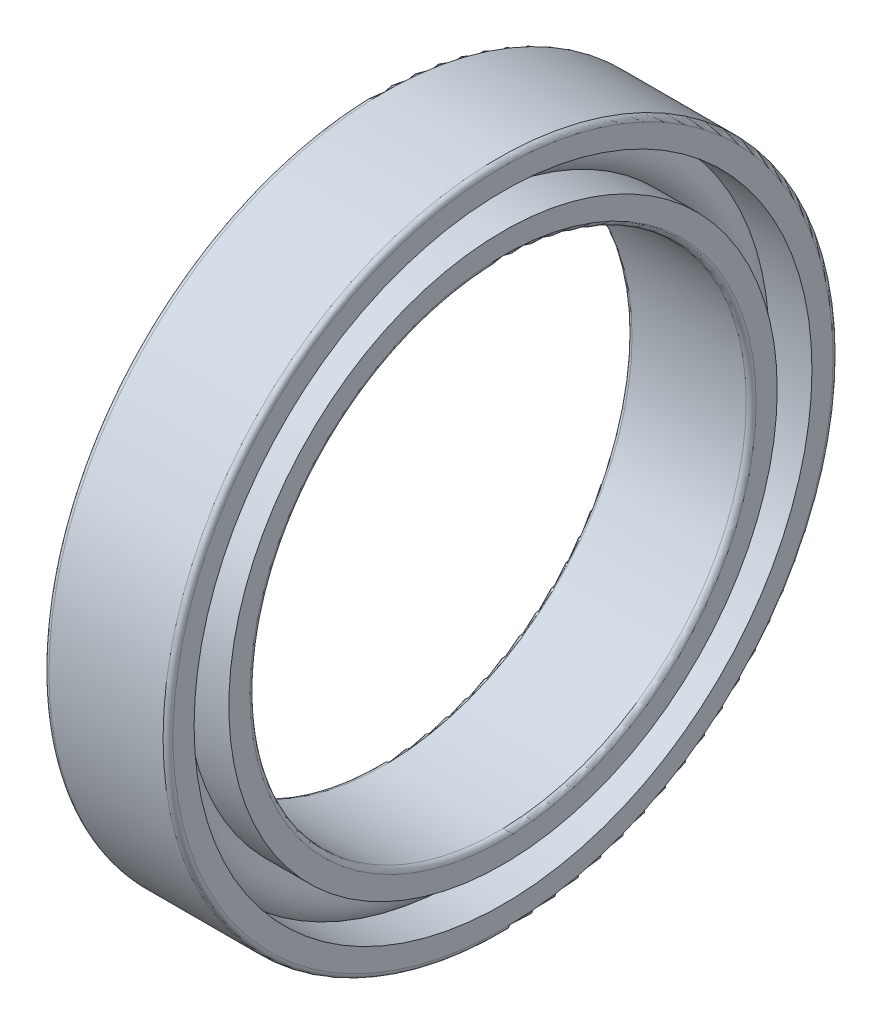
ISO-10303-21;
HEADER;
FILE_DESCRIPTION(('STEP AP214'),'2;1');
FILE_NAME('part.step','',(''),(''),'','','');
FILE_SCHEMA(('AUTOMOTIVE_DESIGN { 1 0 10303 214 1 1 1 1 }'));
ENDSEC;
DATA;
#1=APPLICATION_CONTEXT('core data for automotive mechanical design processes');
#2=APPLICATION_PROTOCOL_DEFINITION('international standard','automotive_design',2000,#1);
#3=PRODUCT_CONTEXT('',#1,'mechanical');
#4=PRODUCT('Part','Part','',(#3));
#5=PRODUCT_RELATED_PRODUCT_CATEGORY('part','',(#4));
#6=PRODUCT_DEFINITION_FORMATION('','',#4);
#7=PRODUCT_DEFINITION_CONTEXT('part definition',#1,'design');
#8=PRODUCT_DEFINITION('design','',#6,#7);
#9=PRODUCT_DEFINITION_SHAPE('','',#8);
#10=(LENGTH_UNIT() NAMED_UNIT(*) SI_UNIT(.MILLI.,.METRE.));
#11=(NAMED_UNIT(*) PLANE_ANGLE_UNIT() SI_UNIT($,.RADIAN.));
#12=(NAMED_UNIT(*) SI_UNIT($,.STERADIAN.) SOLID_ANGLE_UNIT());
#13=UNCERTAINTY_MEASURE_WITH_UNIT(LENGTH_MEASURE(1.E-05),#10,'distance_accuracy_value','');
#14=(GEOMETRIC_REPRESENTATION_CONTEXT(3) GLOBAL_UNCERTAINTY_ASSIGNED_CONTEXT((#13)) GLOBAL_UNIT_ASSIGNED_CONTEXT((#10,
#11,#12)) REPRESENTATION_CONTEXT('',''));
#15=CARTESIAN_POINT('',(0.,0.,0.));
#16=DIRECTION('',(0.,0.,1.));
#17=DIRECTION('',(1.,0.,0.));
#18=AXIS2_PLACEMENT_3D('',#15,#16,#17);
#19=CARTESIAN_POINT('',(0.,0.,0.));
#20=DIRECTION('',(-1.,0.,0.));
#21=DIRECTION('',(0.,0.,1.));
#22=AXIS2_PLACEMENT_3D('',#19,#20,#21);
#23=TOROIDAL_SURFACE('',#22,11.75,1.05);
#24=CARTESIAN_POINT('',(0.782623792124924,0.,0.));
#25=DIRECTION('',(-1.,0.,0.));
#26=DIRECTION('',(0.,0.,1.));
#27=AXIS2_PLACEMENT_3D('',#24,#25,#26);
#28=CIRCLE('',#27,12.45);
#29=CARTESIAN_POINT('',(0.782623792124924,0.,12.45));
#30=VERTEX_POINT('',#29);
#31=EDGE_CURVE('E35',#30,#30,#28,.F.);
#32=ORIENTED_EDGE('',*,*,#31,.T.);
#33=EDGE_LOOP('',(#32));
#34=FACE_BOUND('',#33,.T.);
#35=CARTESIAN_POINT('',(0.782623792124928,0.,0.));
#36=DIRECTION('',(-1.,0.,0.));
#37=DIRECTION('',(0.,0.,1.));
#38=AXIS2_PLACEMENT_3D('',#35,#36,#37);
#39=CIRCLE('',#38,11.05);
#40=CARTESIAN_POINT('',(0.782623792124928,0.,11.05));
#41=VERTEX_POINT('',#40);
#42=EDGE_CURVE('E10',#41,#41,#39,.T.);
#43=ORIENTED_EDGE('',*,*,#42,.T.);
#44=EDGE_LOOP('',(#43));
#45=FACE_BOUND('',#44,.T.);
#46=ADVANCED_FACE('F31',(#34,#45),#23,.T.);
#47=CARTESIAN_POINT('',(-20.6375,0.,0.));
#48=DIRECTION('',(1.,0.,0.));
#49=DIRECTION('',(0.,0.,-1.));
#50=AXIS2_PLACEMENT_3D('',#47,#48,#49);
#51=CYLINDRICAL_SURFACE('',#50,11.05);
#52=CARTESIAN_POINT('',(2.5,0.,0.));
#53=DIRECTION('',(1.,0.,0.));
#54=DIRECTION('',(0.,0.,-1.));
#55=AXIS2_PLACEMENT_3D('',#52,#53,#54);
#56=CIRCLE('',#55,11.05);
#57=CARTESIAN_POINT('',(2.5,0.,-11.05));
#58=VERTEX_POINT('',#57);
#59=EDGE_CURVE('E44',#58,#58,#56,.T.);
#60=ORIENTED_EDGE('',*,*,#59,.F.);
#61=EDGE_LOOP('',(#60));
#62=FACE_BOUND('',#61,.T.);
#63=ORIENTED_EDGE('',*,*,#42,.F.);
#64=EDGE_LOOP('',(#63));
#65=FACE_BOUND('',#64,.T.);
#66=ADVANCED_FACE('F83',(#62,#65),#51,.T.);
#67=CARTESIAN_POINT('',(-20.6375,0.,0.));
#68=DIRECTION('',(1.,0.,0.));
#69=DIRECTION('',(0.,0.,-1.));
#70=AXIS2_PLACEMENT_3D('',#67,#68,#69);
#71=CYLINDRICAL_SURFACE('',#70,11.05);
#72=CARTESIAN_POINT('',(-2.5,0.,0.));
#73=DIRECTION('',(1.,0.,0.));
#74=DIRECTION('',(0.,0.,-1.));
#75=AXIS2_PLACEMENT_3D('',#72,#73,#74);
#76=CIRCLE('',#75,11.05);
#77=CARTESIAN_POINT('',(-2.5,0.,-11.05));
#78=VERTEX_POINT('',#77);
#79=EDGE_CURVE('E53',#78,#78,#76,.T.);
#80=ORIENTED_EDGE('',*,*,#79,.T.);
#81=EDGE_LOOP('',(#80));
#82=FACE_BOUND('',#81,.T.);
#83=CARTESIAN_POINT('',(-0.782623792124928,0.,0.));
#84=DIRECTION('',(1.,0.,0.));
#85=DIRECTION('',(0.,0.,-1.));
#86=AXIS2_PLACEMENT_3D('',#83,#84,#85);
#87=CIRCLE('',#86,11.05);
#88=CARTESIAN_POINT('',(-0.782623792124928,0.,-11.05));
#89=VERTEX_POINT('',#88);
#90=EDGE_CURVE('E39',#89,#89,#87,.T.);
#91=ORIENTED_EDGE('',*,*,#90,.F.);
#92=EDGE_LOOP('',(#91));
#93=FACE_BOUND('',#92,.T.);
#94=ADVANCED_FACE('F86',(#82,#93),#71,.T.);
#95=CARTESIAN_POINT('',(2.5,10.2,0.));
#96=DIRECTION('',(1.,0.,0.));
#97=DIRECTION('',(0.,0.,-1.));
#98=AXIS2_PLACEMENT_3D('',#95,#96,#97);
#99=PLANE('',#98);
#100=ORIENTED_EDGE('',*,*,#59,.T.);
#101=EDGE_LOOP('',(#100));
#102=FACE_BOUND('',#101,.T.);
#103=CARTESIAN_POINT('',(2.5,0.,0.));
#104=DIRECTION('',(1.,0.,0.));
#105=DIRECTION('',(0.,0.,-1.));
#106=AXIS2_PLACEMENT_3D('',#103,#104,#105);
#107=CIRCLE('',#106,10.2);
#108=CARTESIAN_POINT('',(2.5,0.,-10.2));
#109=VERTEX_POINT('',#108);
#110=EDGE_CURVE('E75',#109,#109,#107,.T.);
#111=ORIENTED_EDGE('',*,*,#110,.F.);
#112=EDGE_LOOP('',(#111));
#113=FACE_BOUND('',#112,.T.);
#114=ADVANCED_FACE('F80',(#102,#113),#99,.T.);
#115=CARTESIAN_POINT('',(2.3,0.,0.));
#116=DIRECTION('',(1.,0.,0.));
#117=DIRECTION('',(0.,0.,-1.));
#118=AXIS2_PLACEMENT_3D('',#115,#116,#117);
#119=TOROIDAL_SURFACE('',#118,10.2,0.2);
#120=ORIENTED_EDGE('',*,*,#110,.T.);
#121=EDGE_LOOP('',(#120));
#122=FACE_BOUND('',#121,.T.);
#123=CARTESIAN_POINT('',(2.3,0.,0.));
#124=DIRECTION('',(1.,0.,0.));
#125=DIRECTION('',(0.,0.,-1.));
#126=AXIS2_PLACEMENT_3D('',#123,#124,#125);
#127=CIRCLE('',#126,10.);
#128=CARTESIAN_POINT('',(2.3,0.,-10.));
#129=VERTEX_POINT('',#128);
#130=EDGE_CURVE('E72',#129,#129,#127,.T.);
#131=ORIENTED_EDGE('',*,*,#130,.F.);
#132=EDGE_LOOP('',(#131));
#133=FACE_BOUND('',#132,.T.);
#134=ADVANCED_FACE('F97',(#122,#133),#119,.T.);
#135=CARTESIAN_POINT('',(-20.6375,0.,0.));
#136=DIRECTION('',(1.,0.,0.));
#137=DIRECTION('',(0.,0.,-1.));
#138=AXIS2_PLACEMENT_3D('',#135,#136,#137);
#139=CYLINDRICAL_SURFACE('',#138,10.);
#140=ORIENTED_EDGE('',*,*,#130,.T.);
#141=EDGE_LOOP('',(#140));
#142=FACE_BOUND('',#141,.T.);
#143=CARTESIAN_POINT('',(-2.3,0.,0.));
#144=DIRECTION('',(1.,0.,0.));
#145=DIRECTION('',(0.,0.,-1.));
#146=AXIS2_PLACEMENT_3D('',#143,#144,#145);
#147=CIRCLE('',#146,10.);
#148=CARTESIAN_POINT('',(-2.3,0.,-10.));
#149=VERTEX_POINT('',#148);
#150=EDGE_CURVE('E69',#149,#149,#147,.T.);
#151=ORIENTED_EDGE('',*,*,#150,.F.);
#152=EDGE_LOOP('',(#151));
#153=FACE_BOUND('',#152,.T.);
#154=ADVANCED_FACE('F100',(#142,#153),#139,.F.);
#155=CARTESIAN_POINT('',(-2.3,0.,0.));
#156=DIRECTION('',(1.,0.,0.));
#157=DIRECTION('',(0.,0.,-1.));
#158=AXIS2_PLACEMENT_3D('',#155,#156,#157);
#159=TOROIDAL_SURFACE('',#158,10.2,0.2);
#160=ORIENTED_EDGE('',*,*,#150,.T.);
#161=EDGE_LOOP('',(#160));
#162=FACE_BOUND('',#161,.T.);
#163=CARTESIAN_POINT('',(-2.5,0.,0.));
#164=DIRECTION('',(1.,0.,0.));
#165=DIRECTION('',(0.,0.,-1.));
#166=AXIS2_PLACEMENT_3D('',#163,#164,#165);
#167=CIRCLE('',#166,10.2);
#168=CARTESIAN_POINT('',(-2.5,0.,-10.2));
#169=VERTEX_POINT('',#168);
#170=EDGE_CURVE('E66',#169,#169,#167,.T.);
#171=ORIENTED_EDGE('',*,*,#170,.F.);
#172=EDGE_LOOP('',(#171));
#173=FACE_BOUND('',#172,.T.);
#174=ADVANCED_FACE('F104',(#162,#173),#159,.T.);
#175=CARTESIAN_POINT('',(-2.5,11.05,0.));
#176=DIRECTION('',(-1.,0.,0.));
#177=DIRECTION('',(0.,0.,1.));
#178=AXIS2_PLACEMENT_3D('',#175,#176,#177);
#179=PLANE('',#178);
#180=ORIENTED_EDGE('',*,*,#170,.T.);
#181=EDGE_LOOP('',(#180));
#182=FACE_BOUND('',#181,.T.);
#183=ORIENTED_EDGE('',*,*,#79,.F.);
#184=EDGE_LOOP('',(#183));
#185=FACE_BOUND('',#184,.T.);
#186=ADVANCED_FACE('F108',(#182,#185),#179,.T.);
#187=CARTESIAN_POINT('',(-0.782623792124924,0.,0.));
#188=DIRECTION('',(1.,0.,0.));
#189=DIRECTION('',(0.,0.,-1.));
#190=AXIS2_PLACEMENT_3D('',#187,#188,#189);
#191=CIRCLE('',#190,12.45);
#192=CARTESIAN_POINT('',(-0.782623792124924,0.,-12.45));
#193=VERTEX_POINT('',#192);
#194=EDGE_CURVE('E47',#193,#193,#191,.F.);
#195=ORIENTED_EDGE('',*,*,#194,.T.);
#196=EDGE_LOOP('',(#195));
#197=FACE_BOUND('',#196,.T.);
#198=ORIENTED_EDGE('',*,*,#90,.T.);
#199=EDGE_LOOP('',(#198));
#200=FACE_BOUND('',#199,.T.);
#201=ADVANCED_FACE('F33',(#197,#200),#23,.T.);
#202=CARTESIAN_POINT('',(-20.6375,0.,0.));
#203=DIRECTION('',(1.,0.,0.));
#204=DIRECTION('',(0.,0.,-1.));
#205=AXIS2_PLACEMENT_3D('',#202,#203,#204);
#206=CYLINDRICAL_SURFACE('',#205,12.45);
#207=CARTESIAN_POINT('',(2.5,0.,0.));
#208=DIRECTION('',(1.,0.,0.));
#209=DIRECTION('',(0.,0.,-1.));
#210=AXIS2_PLACEMENT_3D('',#207,#208,#209);
#211=CIRCLE('',#210,12.45);
#212=CARTESIAN_POINT('',(2.5,0.,-12.45));
#213=VERTEX_POINT('',#212);
#214=EDGE_CURVE('E49',#213,#213,#211,.T.);
#215=ORIENTED_EDGE('',*,*,#214,.T.);
#216=EDGE_LOOP('',(#215));
#217=FACE_BOUND('',#216,.T.);
#218=ORIENTED_EDGE('',*,*,#31,.F.);
#219=EDGE_LOOP('',(#218));
#220=FACE_BOUND('',#219,.T.);
#221=ADVANCED_FACE('F113',(#217,#220),#206,.F.);
#222=CARTESIAN_POINT('',(-20.6375,0.,0.));
#223=DIRECTION('',(1.,0.,0.));
#224=DIRECTION('',(0.,0.,-1.));
#225=AXIS2_PLACEMENT_3D('',#222,#223,#224);
#226=CYLINDRICAL_SURFACE('',#225,12.45);
#227=CARTESIAN_POINT('',(-2.5,0.,0.));
#228=DIRECTION('',(1.,0.,0.));
#229=DIRECTION('',(0.,0.,-1.));
#230=AXIS2_PLACEMENT_3D('',#227,#228,#229);
#231=CIRCLE('',#230,12.45);
#232=CARTESIAN_POINT('',(-2.5,0.,-12.45));
#233=VERTEX_POINT('',#232);
#234=EDGE_CURVE('E144',#233,#233,#231,.T.);
#235=ORIENTED_EDGE('',*,*,#234,.F.);
#236=EDGE_LOOP('',(#235));
#237=FACE_BOUND('',#236,.T.);
#238=ORIENTED_EDGE('',*,*,#194,.F.);
#239=EDGE_LOOP('',(#238));
#240=FACE_BOUND('',#239,.T.);
#241=ADVANCED_FACE('F116',(#237,#240),#226,.F.);
#242=CARTESIAN_POINT('',(2.5,13.3,0.));
#243=DIRECTION('',(1.,0.,0.));
#244=DIRECTION('',(0.,0.,-1.));
#245=AXIS2_PLACEMENT_3D('',#242,#243,#244);
#246=PLANE('',#245);
#247=CARTESIAN_POINT('',(2.5,0.,0.));
#248=DIRECTION('',(1.,0.,0.));
#249=DIRECTION('',(0.,0.,-1.));
#250=AXIS2_PLACEMENT_3D('',#247,#248,#249);
#251=CIRCLE('',#250,13.3);
#252=CARTESIAN_POINT('',(2.5,0.,-13.3));
#253=VERTEX_POINT('',#252);
#254=EDGE_CURVE('E55',#253,#253,#251,.T.);
#255=ORIENTED_EDGE('',*,*,#254,.T.);
#256=EDGE_LOOP('',(#255));
#257=FACE_BOUND('',#256,.T.);
#258=ORIENTED_EDGE('',*,*,#214,.F.);
#259=EDGE_LOOP('',(#258));
#260=FACE_BOUND('',#259,.T.);
#261=ADVANCED_FACE('F117',(#257,#260),#246,.T.);
#262=CARTESIAN_POINT('',(2.3,0.,0.));
#263=DIRECTION('',(1.,0.,0.));
#264=DIRECTION('',(0.,0.,-1.));
#265=AXIS2_PLACEMENT_3D('',#262,#263,#264);
#266=TOROIDAL_SURFACE('',#265,13.3,0.199999999999999);
#267=CARTESIAN_POINT('',(2.3,0.,0.));
#268=DIRECTION('',(1.,0.,0.));
#269=DIRECTION('',(0.,0.,-1.));
#270=AXIS2_PLACEMENT_3D('',#267,#268,#269);
#271=CIRCLE('',#270,13.5);
#272=CARTESIAN_POINT('',(2.3,0.,-13.5));
#273=VERTEX_POINT('',#272);
#274=EDGE_CURVE('E60',#273,#273,#271,.T.);
#275=ORIENTED_EDGE('',*,*,#274,.T.);
#276=EDGE_LOOP('',(#275));
#277=FACE_BOUND('',#276,.T.);
#278=ORIENTED_EDGE('',*,*,#254,.F.);
#279=EDGE_LOOP('',(#278));
#280=FACE_BOUND('',#279,.T.);
#281=ADVANCED_FACE('F120',(#277,#280),#266,.T.);
#282=CARTESIAN_POINT('',(-20.6375,0.,0.));
#283=DIRECTION('',(1.,0.,0.));
#284=DIRECTION('',(0.,0.,-1.));
#285=AXIS2_PLACEMENT_3D('',#282,#283,#284);
#286=CYLINDRICAL_SURFACE('',#285,13.5);
#287=CARTESIAN_POINT('',(-2.3,0.,0.));
#288=DIRECTION('',(1.,0.,0.));
#289=DIRECTION('',(0.,0.,-1.));
#290=AXIS2_PLACEMENT_3D('',#287,#288,#289);
#291=CIRCLE('',#290,13.5);
#292=CARTESIAN_POINT('',(-2.3,0.,-13.5));
#293=VERTEX_POINT('',#292);
#294=EDGE_CURVE('E148',#293,#293,#291,.T.);
#295=ORIENTED_EDGE('',*,*,#294,.T.);
#296=EDGE_LOOP('',(#295));
#297=FACE_BOUND('',#296,.T.);
#298=ORIENTED_EDGE('',*,*,#274,.F.);
#299=EDGE_LOOP('',(#298));
#300=FACE_BOUND('',#299,.T.);
#301=ADVANCED_FACE('F124',(#297,#300),#286,.T.);
#302=CARTESIAN_POINT('',(-2.3,0.,0.));
#303=DIRECTION('',(1.,0.,0.));
#304=DIRECTION('',(0.,0.,-1.));
#305=AXIS2_PLACEMENT_3D('',#302,#303,#304);
#306=TOROIDAL_SURFACE('',#305,13.3,0.199999999999999);
#307=CARTESIAN_POINT('',(-2.5,0.,0.));
#308=DIRECTION('',(1.,0.,0.));
#309=DIRECTION('',(0.,0.,-1.));
#310=AXIS2_PLACEMENT_3D('',#307,#308,#309);
#311=CIRCLE('',#310,13.3);
#312=CARTESIAN_POINT('',(-2.5,0.,-13.3));
#313=VERTEX_POINT('',#312);
#314=EDGE_CURVE('E145',#313,#313,#311,.T.);
#315=ORIENTED_EDGE('',*,*,#314,.T.);
#316=EDGE_LOOP('',(#315));
#317=FACE_BOUND('',#316,.T.);
#318=ORIENTED_EDGE('',*,*,#294,.F.);
#319=EDGE_LOOP('',(#318));
#320=FACE_BOUND('',#319,.T.);
#321=ADVANCED_FACE('F128',(#317,#320),#306,.T.);
#322=CARTESIAN_POINT('',(-2.5,12.45,0.));
#323=DIRECTION('',(-1.,0.,0.));
#324=DIRECTION('',(0.,0.,1.));
#325=AXIS2_PLACEMENT_3D('',#322,#323,#324);
#326=PLANE('',#325);
#327=ORIENTED_EDGE('',*,*,#234,.T.);
#328=EDGE_LOOP('',(#327));
#329=FACE_BOUND('',#328,.T.);
#330=ORIENTED_EDGE('',*,*,#314,.F.);
#331=EDGE_LOOP('',(#330));
#332=FACE_BOUND('',#331,.T.);
#333=ADVANCED_FACE('F132',(#329,#332),#326,.T.);
#334=CLOSED_SHELL('',(#46,#66,#94,#114,#134,#154,#174,#186,#201,#221,#241,#261,#281,#301,#321,#333));
#335=MANIFOLD_SOLID_BREP('B2',#334);
#336=ADVANCED_BREP_SHAPE_REPRESENTATION('',(#18,#335),#14);
#337=SHAPE_DEFINITION_REPRESENTATION(#9,#336);
ENDSEC;
END-ISO-10303-21;
